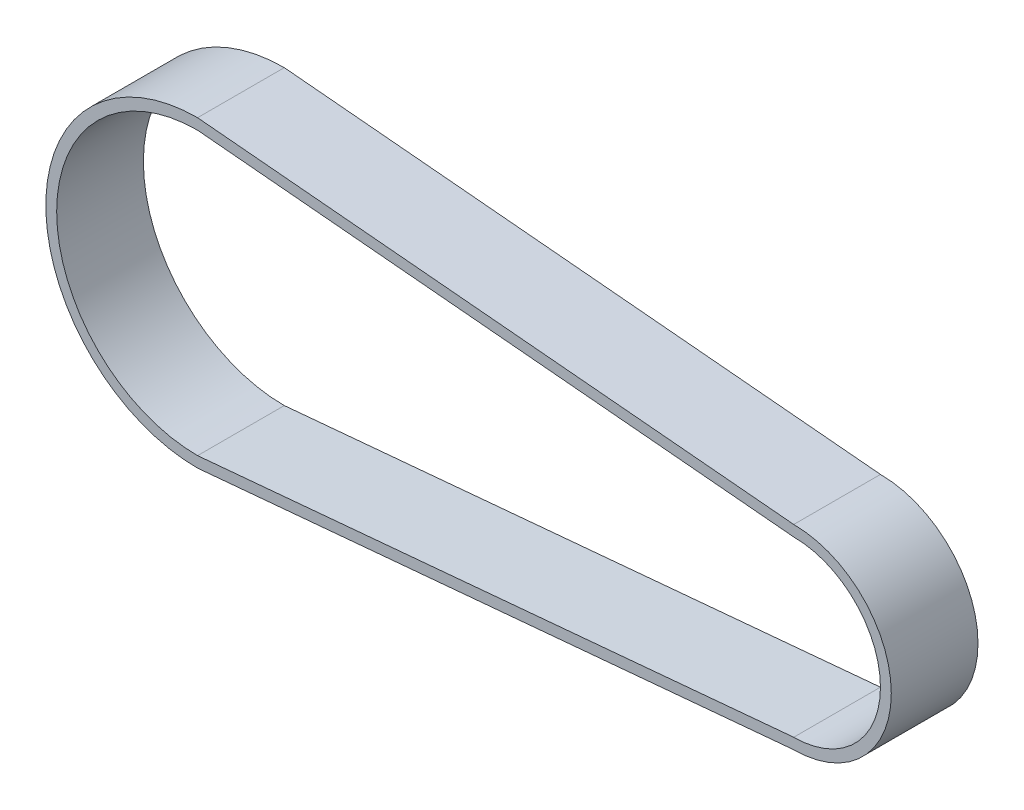
ISO-10303-21;
HEADER;
FILE_DESCRIPTION(('STEP AP214'),'2;1');
FILE_NAME('part.step','',(''),(''),'','','');
FILE_SCHEMA(('AUTOMOTIVE_DESIGN { 1 0 10303 214 1 1 1 1 }'));
ENDSEC;
DATA;
#1=APPLICATION_CONTEXT('core data for automotive mechanical design processes');
#2=APPLICATION_PROTOCOL_DEFINITION('international standard','automotive_design',2000,#1);
#3=PRODUCT_CONTEXT('',#1,'mechanical');
#4=PRODUCT('Part','Part','',(#3));
#5=PRODUCT_RELATED_PRODUCT_CATEGORY('part','',(#4));
#6=PRODUCT_DEFINITION_FORMATION('','',#4);
#7=PRODUCT_DEFINITION_CONTEXT('part definition',#1,'design');
#8=PRODUCT_DEFINITION('design','',#6,#7);
#9=PRODUCT_DEFINITION_SHAPE('','',#8);
#10=(LENGTH_UNIT() NAMED_UNIT(*) SI_UNIT(.MILLI.,.METRE.));
#11=(NAMED_UNIT(*) PLANE_ANGLE_UNIT() SI_UNIT($,.RADIAN.));
#12=(NAMED_UNIT(*) SI_UNIT($,.STERADIAN.) SOLID_ANGLE_UNIT());
#13=UNCERTAINTY_MEASURE_WITH_UNIT(LENGTH_MEASURE(1.E-05),#10,'distance_accuracy_value','');
#14=(GEOMETRIC_REPRESENTATION_CONTEXT(3) GLOBAL_UNCERTAINTY_ASSIGNED_CONTEXT((#13)) GLOBAL_UNIT_ASSIGNED_CONTEXT((#10,
#11,#12)) REPRESENTATION_CONTEXT('',''));
#15=CARTESIAN_POINT('',(0.,0.,0.));
#16=DIRECTION('',(0.,0.,1.));
#17=DIRECTION('',(1.,0.,0.));
#18=AXIS2_PLACEMENT_3D('',#15,#16,#17);
#19=CARTESIAN_POINT('',(-30.,0.,8.));
#20=DIRECTION('',(0.,0.,1.));
#21=DIRECTION('',(1.,0.,0.));
#22=AXIS2_PLACEMENT_3D('',#19,#20,#21);
#23=PLANE('',#22);
#24=CARTESIAN_POINT('',(-30.,0.,8.));
#25=DIRECTION('',(0.,0.,1.));
#26=DIRECTION('',(1.,0.,0.));
#27=AXIS2_PLACEMENT_3D('',#24,#25,#26);
#28=CIRCLE('',#27,14.);
#29=CARTESIAN_POINT('',(-30.,14.,8.));
#30=VERTEX_POINT('',#29);
#31=CARTESIAN_POINT('',(-30.,-14.,8.));
#32=VERTEX_POINT('',#31);
#33=EDGE_CURVE('E138',#30,#32,#28,.T.);
#34=ORIENTED_EDGE('',*,*,#33,.T.);
#35=DIRECTION('',(0.995893206467704,0.0905357460425188,0.));
#36=VECTOR('',#35,1.);
#37=CARTESIAN_POINT('',(-30.,-14.,8.));
#38=LINE('',#37,#36);
#39=CARTESIAN_POINT('',(25.,-9.,8.));
#40=VERTEX_POINT('',#39);
#41=EDGE_CURVE('E141',#32,#40,#38,.T.);
#42=ORIENTED_EDGE('',*,*,#41,.T.);
#43=CARTESIAN_POINT('',(25.,0.,8.));
#44=DIRECTION('',(0.,0.,1.));
#45=DIRECTION('',(1.,0.,0.));
#46=AXIS2_PLACEMENT_3D('',#43,#44,#45);
#47=CIRCLE('',#46,9.);
#48=CARTESIAN_POINT('',(25.,9.,8.));
#49=VERTEX_POINT('',#48);
#50=EDGE_CURVE('E144',#40,#49,#47,.T.);
#51=ORIENTED_EDGE('',*,*,#50,.T.);
#52=DIRECTION('',(-0.995893206467704,0.0905357460425188,0.));
#53=VECTOR('',#52,1.);
#54=CARTESIAN_POINT('',(-30.,14.,8.));
#55=LINE('',#54,#53);
#56=EDGE_CURVE('E146',#49,#30,#55,.T.);
#57=ORIENTED_EDGE('',*,*,#56,.T.);
#58=EDGE_LOOP('',(#34,#42,#51,#57));
#59=FACE_BOUND('',#58,.T.);
#60=DIRECTION('',(0.995893206467704,0.0905357460425188,0.));
#61=VECTOR('',#60,1.);
#62=CARTESIAN_POINT('',(-30.,-13.,8.));
#63=LINE('',#62,#61);
#64=CARTESIAN_POINT('',(-30.,-13.,8.));
#65=VERTEX_POINT('',#64);
#66=CARTESIAN_POINT('',(25.,-8.,8.));
#67=VERTEX_POINT('',#66);
#68=EDGE_CURVE('E110',#65,#67,#63,.T.);
#69=ORIENTED_EDGE('',*,*,#68,.F.);
#70=CARTESIAN_POINT('',(-30.,0.,8.));
#71=DIRECTION('',(0.,0.,1.));
#72=DIRECTION('',(1.,0.,0.));
#73=AXIS2_PLACEMENT_3D('',#70,#71,#72);
#74=CIRCLE('',#73,13.);
#75=CARTESIAN_POINT('',(-30.,13.,8.));
#76=VERTEX_POINT('',#75);
#77=EDGE_CURVE('E102',#76,#65,#74,.T.);
#78=ORIENTED_EDGE('',*,*,#77,.F.);
#79=DIRECTION('',(-0.995893206467704,0.0905357460425188,0.));
#80=VECTOR('',#79,1.);
#81=CARTESIAN_POINT('',(-30.,13.,8.));
#82=LINE('',#81,#80);
#83=CARTESIAN_POINT('',(25.,8.,8.));
#84=VERTEX_POINT('',#83);
#85=EDGE_CURVE('E124',#84,#76,#82,.T.);
#86=ORIENTED_EDGE('',*,*,#85,.F.);
#87=CARTESIAN_POINT('',(25.,0.,8.));
#88=DIRECTION('',(0.,0.,1.));
#89=DIRECTION('',(-1.,0.,0.));
#90=AXIS2_PLACEMENT_3D('',#87,#88,#89);
#91=CIRCLE('',#90,8.);
#92=EDGE_CURVE('E122',#67,#84,#91,.T.);
#93=ORIENTED_EDGE('',*,*,#92,.F.);
#94=EDGE_LOOP('',(#69,#78,#86,#93));
#95=FACE_BOUND('',#94,.T.);
#96=ADVANCED_FACE('F37',(#59,#95),#23,.T.);
#97=CARTESIAN_POINT('',(-30.,0.,0.));
#98=DIRECTION('',(0.,0.,1.));
#99=DIRECTION('',(1.,0.,0.));
#100=AXIS2_PLACEMENT_3D('',#97,#98,#99);
#101=PLANE('',#100);
#102=CARTESIAN_POINT('',(-30.,0.,0.));
#103=DIRECTION('',(0.,0.,1.));
#104=DIRECTION('',(1.,0.,0.));
#105=AXIS2_PLACEMENT_3D('',#102,#103,#104);
#106=CIRCLE('',#105,14.);
#107=CARTESIAN_POINT('',(-30.,14.,0.));
#108=VERTEX_POINT('',#107);
#109=CARTESIAN_POINT('',(-30.,-14.,0.));
#110=VERTEX_POINT('',#109);
#111=EDGE_CURVE('E118',#108,#110,#106,.T.);
#112=ORIENTED_EDGE('',*,*,#111,.F.);
#113=DIRECTION('',(-0.995893206467704,0.0905357460425188,0.));
#114=VECTOR('',#113,1.);
#115=CARTESIAN_POINT('',(-30.,14.,0.));
#116=LINE('',#115,#114);
#117=CARTESIAN_POINT('',(25.,9.,0.));
#118=VERTEX_POINT('',#117);
#119=EDGE_CURVE('E142',#118,#108,#116,.T.);
#120=ORIENTED_EDGE('',*,*,#119,.F.);
#121=CARTESIAN_POINT('',(25.,0.,0.));
#122=DIRECTION('',(0.,0.,1.));
#123=DIRECTION('',(1.,0.,0.));
#124=AXIS2_PLACEMENT_3D('',#121,#122,#123);
#125=CIRCLE('',#124,9.);
#126=CARTESIAN_POINT('',(25.,-9.,0.));
#127=VERTEX_POINT('',#126);
#128=EDGE_CURVE('E153',#127,#118,#125,.T.);
#129=ORIENTED_EDGE('',*,*,#128,.F.);
#130=DIRECTION('',(0.995893206467704,0.0905357460425188,0.));
#131=VECTOR('',#130,1.);
#132=CARTESIAN_POINT('',(-30.,-14.,0.));
#133=LINE('',#132,#131);
#134=EDGE_CURVE('E151',#110,#127,#133,.T.);
#135=ORIENTED_EDGE('',*,*,#134,.F.);
#136=EDGE_LOOP('',(#112,#120,#129,#135));
#137=FACE_BOUND('',#136,.T.);
#138=CARTESIAN_POINT('',(-30.,0.,0.));
#139=DIRECTION('',(0.,0.,1.));
#140=DIRECTION('',(1.,0.,0.));
#141=AXIS2_PLACEMENT_3D('',#138,#139,#140);
#142=CIRCLE('',#141,13.);
#143=CARTESIAN_POINT('',(-30.,13.,0.));
#144=VERTEX_POINT('',#143);
#145=CARTESIAN_POINT('',(-30.,-13.,0.));
#146=VERTEX_POINT('',#145);
#147=EDGE_CURVE('E60',#144,#146,#142,.T.);
#148=ORIENTED_EDGE('',*,*,#147,.T.);
#149=DIRECTION('',(0.995893206467704,0.0905357460425188,0.));
#150=VECTOR('',#149,1.);
#151=CARTESIAN_POINT('',(-30.,-13.,0.));
#152=LINE('',#151,#150);
#153=CARTESIAN_POINT('',(25.,-8.,0.));
#154=VERTEX_POINT('',#153);
#155=EDGE_CURVE('E117',#146,#154,#152,.T.);
#156=ORIENTED_EDGE('',*,*,#155,.T.);
#157=CARTESIAN_POINT('',(25.,0.,0.));
#158=DIRECTION('',(0.,0.,1.));
#159=DIRECTION('',(-1.,0.,0.));
#160=AXIS2_PLACEMENT_3D('',#157,#158,#159);
#161=CIRCLE('',#160,8.);
#162=CARTESIAN_POINT('',(25.,8.,0.));
#163=VERTEX_POINT('',#162);
#164=EDGE_CURVE('E130',#154,#163,#161,.T.);
#165=ORIENTED_EDGE('',*,*,#164,.T.);
#166=DIRECTION('',(-0.995893206467704,0.0905357460425188,0.));
#167=VECTOR('',#166,1.);
#168=CARTESIAN_POINT('',(-30.,13.,0.));
#169=LINE('',#168,#167);
#170=EDGE_CURVE('E111',#163,#144,#169,.T.);
#171=ORIENTED_EDGE('',*,*,#170,.T.);
#172=EDGE_LOOP('',(#148,#156,#165,#171));
#173=FACE_BOUND('',#172,.T.);
#174=ADVANCED_FACE('F171',(#137,#173),#101,.F.);
#175=CARTESIAN_POINT('',(-30.,0.,8.));
#176=DIRECTION('',(0.,0.,-1.));
#177=DIRECTION('',(-1.,0.,0.));
#178=AXIS2_PLACEMENT_3D('',#175,#176,#177);
#179=CYLINDRICAL_SURFACE('',#178,14.);
#180=ORIENTED_EDGE('',*,*,#111,.T.);
#181=DIRECTION('',(0.,0.,-1.));
#182=VECTOR('',#181,1.);
#183=CARTESIAN_POINT('',(-30.,-14.,8.));
#184=LINE('',#183,#182);
#185=EDGE_CURVE('E11',#32,#110,#184,.T.);
#186=ORIENTED_EDGE('',*,*,#185,.F.);
#187=ORIENTED_EDGE('',*,*,#33,.F.);
#188=DIRECTION('',(0.,0.,-1.));
#189=VECTOR('',#188,1.);
#190=CARTESIAN_POINT('',(-30.,14.,8.));
#191=LINE('',#190,#189);
#192=EDGE_CURVE('E148',#30,#108,#191,.T.);
#193=ORIENTED_EDGE('',*,*,#192,.T.);
#194=EDGE_LOOP('',(#180,#186,#187,#193));
#195=FACE_BOUND('',#194,.T.);
#196=ADVANCED_FACE('F39',(#195),#179,.T.);
#197=CARTESIAN_POINT('',(-30.,-14.,8.));
#198=DIRECTION('',(-0.0905357460425188,0.995893206467704,0.));
#199=DIRECTION('',(-0.995893206467704,-0.0905357460425188,0.));
#200=AXIS2_PLACEMENT_3D('',#197,#198,#199);
#201=PLANE('',#200);
#202=ORIENTED_EDGE('',*,*,#134,.T.);
#203=DIRECTION('',(0.,0.,-1.));
#204=VECTOR('',#203,1.);
#205=CARTESIAN_POINT('',(25.,-9.,8.));
#206=LINE('',#205,#204);
#207=EDGE_CURVE('E45',#40,#127,#206,.T.);
#208=ORIENTED_EDGE('',*,*,#207,.F.);
#209=ORIENTED_EDGE('',*,*,#41,.F.);
#210=ORIENTED_EDGE('',*,*,#185,.T.);
#211=EDGE_LOOP('',(#202,#208,#209,#210));
#212=FACE_BOUND('',#211,.T.);
#213=ADVANCED_FACE('F181',(#212),#201,.F.);
#214=CARTESIAN_POINT('',(25.,0.,8.));
#215=DIRECTION('',(0.,0.,-1.));
#216=DIRECTION('',(-1.,0.,0.));
#217=AXIS2_PLACEMENT_3D('',#214,#215,#216);
#218=CYLINDRICAL_SURFACE('',#217,9.);
#219=ORIENTED_EDGE('',*,*,#128,.T.);
#220=DIRECTION('',(0.,0.,-1.));
#221=VECTOR('',#220,1.);
#222=CARTESIAN_POINT('',(25.,9.,8.));
#223=LINE('',#222,#221);
#224=EDGE_CURVE('E158',#49,#118,#223,.T.);
#225=ORIENTED_EDGE('',*,*,#224,.F.);
#226=ORIENTED_EDGE('',*,*,#50,.F.);
#227=ORIENTED_EDGE('',*,*,#207,.T.);
#228=EDGE_LOOP('',(#219,#225,#226,#227));
#229=FACE_BOUND('',#228,.T.);
#230=ADVANCED_FACE('F165',(#229),#218,.T.);
#231=CARTESIAN_POINT('',(-30.,14.,8.));
#232=DIRECTION('',(-0.0905357460425188,-0.995893206467704,0.));
#233=DIRECTION('',(0.995893206467704,-0.0905357460425188,0.));
#234=AXIS2_PLACEMENT_3D('',#231,#232,#233);
#235=PLANE('',#234);
#236=ORIENTED_EDGE('',*,*,#119,.T.);
#237=ORIENTED_EDGE('',*,*,#192,.F.);
#238=ORIENTED_EDGE('',*,*,#56,.F.);
#239=ORIENTED_EDGE('',*,*,#224,.T.);
#240=EDGE_LOOP('',(#236,#237,#238,#239));
#241=FACE_BOUND('',#240,.T.);
#242=ADVANCED_FACE('F175',(#241),#235,.F.);
#243=CARTESIAN_POINT('',(-30.,0.,8.));
#244=DIRECTION('',(0.,0.,-1.));
#245=DIRECTION('',(-1.,0.,0.));
#246=AXIS2_PLACEMENT_3D('',#243,#244,#245);
#247=CYLINDRICAL_SURFACE('',#246,13.);
#248=ORIENTED_EDGE('',*,*,#147,.F.);
#249=DIRECTION('',(0.,0.,-1.));
#250=VECTOR('',#249,1.);
#251=CARTESIAN_POINT('',(-30.,13.,8.));
#252=LINE('',#251,#250);
#253=EDGE_CURVE('E106',#76,#144,#252,.T.);
#254=ORIENTED_EDGE('',*,*,#253,.F.);
#255=ORIENTED_EDGE('',*,*,#77,.T.);
#256=DIRECTION('',(0.,0.,-1.));
#257=VECTOR('',#256,1.);
#258=CARTESIAN_POINT('',(-30.,-13.,8.));
#259=LINE('',#258,#257);
#260=EDGE_CURVE('E105',#65,#146,#259,.T.);
#261=ORIENTED_EDGE('',*,*,#260,.T.);
#262=EDGE_LOOP('',(#248,#254,#255,#261));
#263=FACE_BOUND('',#262,.T.);
#264=ADVANCED_FACE('F104',(#263),#247,.F.);
#265=CARTESIAN_POINT('',(-30.,-13.,8.));
#266=DIRECTION('',(-0.0905357460425188,0.995893206467704,0.));
#267=DIRECTION('',(-0.995893206467704,-0.0905357460425188,0.));
#268=AXIS2_PLACEMENT_3D('',#265,#266,#267);
#269=PLANE('',#268);
#270=ORIENTED_EDGE('',*,*,#155,.F.);
#271=ORIENTED_EDGE('',*,*,#260,.F.);
#272=ORIENTED_EDGE('',*,*,#68,.T.);
#273=DIRECTION('',(0.,0.,-1.));
#274=VECTOR('',#273,1.);
#275=CARTESIAN_POINT('',(25.,-8.,8.));
#276=LINE('',#275,#274);
#277=EDGE_CURVE('E119',#67,#154,#276,.T.);
#278=ORIENTED_EDGE('',*,*,#277,.T.);
#279=EDGE_LOOP('',(#270,#271,#272,#278));
#280=FACE_BOUND('',#279,.T.);
#281=ADVANCED_FACE('F114',(#280),#269,.T.);
#282=CARTESIAN_POINT('',(25.,0.,8.));
#283=DIRECTION('',(0.,0.,-1.));
#284=DIRECTION('',(-1.,0.,0.));
#285=AXIS2_PLACEMENT_3D('',#282,#283,#284);
#286=CYLINDRICAL_SURFACE('',#285,8.);
#287=ORIENTED_EDGE('',*,*,#164,.F.);
#288=ORIENTED_EDGE('',*,*,#277,.F.);
#289=ORIENTED_EDGE('',*,*,#92,.T.);
#290=DIRECTION('',(0.,0.,-1.));
#291=VECTOR('',#290,1.);
#292=CARTESIAN_POINT('',(25.,8.,8.));
#293=LINE('',#292,#291);
#294=EDGE_CURVE('E52',#84,#163,#293,.T.);
#295=ORIENTED_EDGE('',*,*,#294,.T.);
#296=EDGE_LOOP('',(#287,#288,#289,#295));
#297=FACE_BOUND('',#296,.T.);
#298=ADVANCED_FACE('F204',(#297),#286,.F.);
#299=CARTESIAN_POINT('',(-30.,13.,8.));
#300=DIRECTION('',(-0.0905357460425188,-0.995893206467704,0.));
#301=DIRECTION('',(0.995893206467704,-0.0905357460425188,0.));
#302=AXIS2_PLACEMENT_3D('',#299,#300,#301);
#303=PLANE('',#302);
#304=ORIENTED_EDGE('',*,*,#170,.F.);
#305=ORIENTED_EDGE('',*,*,#294,.F.);
#306=ORIENTED_EDGE('',*,*,#85,.T.);
#307=ORIENTED_EDGE('',*,*,#253,.T.);
#308=EDGE_LOOP('',(#304,#305,#306,#307));
#309=FACE_BOUND('',#308,.T.);
#310=ADVANCED_FACE('F208',(#309),#303,.T.);
#311=CLOSED_SHELL('',(#96,#174,#196,#213,#230,#242,#264,#281,#298,#310));
#312=MANIFOLD_SOLID_BREP('B2',#311);
#313=ADVANCED_BREP_SHAPE_REPRESENTATION('',(#18,#312),#14);
#314=SHAPE_DEFINITION_REPRESENTATION(#9,#313);
ENDSEC;
END-ISO-10303-21;
